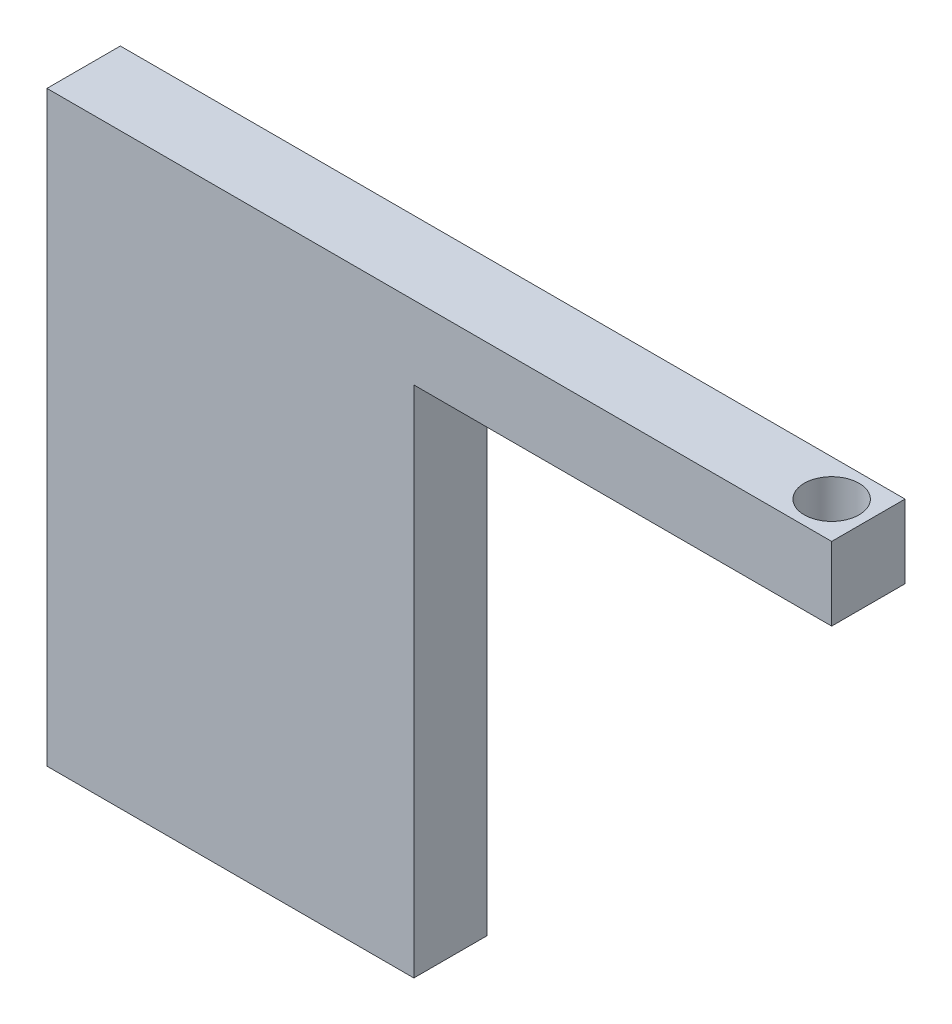
ISO-10303-21;
HEADER;
FILE_DESCRIPTION(('STEP AP214'),'2;1');
FILE_NAME('part.step','',(''),(''),'','','');
FILE_SCHEMA(('AUTOMOTIVE_DESIGN { 1 0 10303 214 1 1 1 1 }'));
ENDSEC;
DATA;
#1=APPLICATION_CONTEXT('core data for automotive mechanical design processes');
#2=APPLICATION_PROTOCOL_DEFINITION('international standard','automotive_design',2000,#1);
#3=PRODUCT_CONTEXT('',#1,'mechanical');
#4=PRODUCT('Part','Part','',(#3));
#5=PRODUCT_RELATED_PRODUCT_CATEGORY('part','',(#4));
#6=PRODUCT_DEFINITION_FORMATION('','',#4);
#7=PRODUCT_DEFINITION_CONTEXT('part definition',#1,'design');
#8=PRODUCT_DEFINITION('design','',#6,#7);
#9=PRODUCT_DEFINITION_SHAPE('','',#8);
#10=(LENGTH_UNIT() NAMED_UNIT(*) SI_UNIT(.MILLI.,.METRE.));
#11=(NAMED_UNIT(*) PLANE_ANGLE_UNIT() SI_UNIT($,.RADIAN.));
#12=(NAMED_UNIT(*) SI_UNIT($,.STERADIAN.) SOLID_ANGLE_UNIT());
#13=UNCERTAINTY_MEASURE_WITH_UNIT(LENGTH_MEASURE(1.E-05),#10,'distance_accuracy_value','');
#14=(GEOMETRIC_REPRESENTATION_CONTEXT(3) GLOBAL_UNCERTAINTY_ASSIGNED_CONTEXT((#13)) GLOBAL_UNIT_ASSIGNED_CONTEXT((#10,
#11,#12)) REPRESENTATION_CONTEXT('',''));
#15=CARTESIAN_POINT('',(0.,0.,0.));
#16=DIRECTION('',(0.,0.,1.));
#17=DIRECTION('',(1.,0.,0.));
#18=AXIS2_PLACEMENT_3D('',#15,#16,#17);
#19=CARTESIAN_POINT('',(-106.611570247934,197.933884297521,10.));
#20=DIRECTION('',(0.,-1.,0.));
#21=DIRECTION('',(0.,0.,-1.));
#22=AXIS2_PLACEMENT_3D('',#19,#20,#21);
#23=PLANE('',#22);
#24=CARTESIAN_POINT('',(-4.66942148793389,197.933884297521,5.));
#25=DIRECTION('',(0.,-1.,0.));
#26=DIRECTION('',(0.,0.,-1.));
#27=AXIS2_PLACEMENT_3D('',#24,#25,#26);
#28=CIRCLE('',#27,3.73526488773257);
#29=CARTESIAN_POINT('',(-4.66942148793389,197.933884297521,1.26473511226743));
#30=VERTEX_POINT('',#29);
#31=EDGE_CURVE('E122',#30,#30,#28,.T.);
#32=ORIENTED_EDGE('',*,*,#31,.T.);
#33=EDGE_LOOP('',(#32));
#34=FACE_BOUND('',#33,.T.);
#35=DIRECTION('',(-1.,0.,0.));
#36=VECTOR('',#35,1.);
#37=CARTESIAN_POINT('',(-106.611570247934,197.933884297521,0.));
#38=LINE('',#37,#36);
#39=CARTESIAN_POINT('',(0.33057851206611,197.933884297521,0.));
#40=VERTEX_POINT('',#39);
#41=CARTESIAN_POINT('',(-106.611570247934,197.933884297521,0.));
#42=VERTEX_POINT('',#41);
#43=EDGE_CURVE('E118',#40,#42,#38,.T.);
#44=ORIENTED_EDGE('',*,*,#43,.T.);
#45=DIRECTION('',(0.,0.,-1.));
#46=VECTOR('',#45,1.);
#47=CARTESIAN_POINT('',(-106.611570247934,197.933884297521,10.));
#48=LINE('',#47,#46);
#49=CARTESIAN_POINT('',(-106.611570247934,197.933884297521,10.));
#50=VERTEX_POINT('',#49);
#51=EDGE_CURVE('E11',#50,#42,#48,.T.);
#52=ORIENTED_EDGE('',*,*,#51,.F.);
#53=DIRECTION('',(-1.,0.,0.));
#54=VECTOR('',#53,1.);
#55=CARTESIAN_POINT('',(-106.611570247934,197.933884297521,10.));
#56=LINE('',#55,#54);
#57=CARTESIAN_POINT('',(0.33057851206611,197.933884297521,10.));
#58=VERTEX_POINT('',#57);
#59=EDGE_CURVE('E129',#58,#50,#56,.T.);
#60=ORIENTED_EDGE('',*,*,#59,.F.);
#61=DIRECTION('',(0.,0.,-1.));
#62=VECTOR('',#61,1.);
#63=CARTESIAN_POINT('',(0.33057851206611,197.933884297521,10.));
#64=LINE('',#63,#62);
#65=EDGE_CURVE('E114',#58,#40,#64,.T.);
#66=ORIENTED_EDGE('',*,*,#65,.T.);
#67=EDGE_LOOP('',(#44,#52,#60,#66));
#68=FACE_BOUND('',#67,.T.);
#69=ADVANCED_FACE('F33',(#34,#68),#23,.F.);
#70=CARTESIAN_POINT('',(-106.611570247934,117.933884297521,10.));
#71=DIRECTION('',(1.,0.,0.));
#72=DIRECTION('',(0.,0.,-1.));
#73=AXIS2_PLACEMENT_3D('',#70,#71,#72);
#74=PLANE('',#73);
#75=DIRECTION('',(0.,-1.,0.));
#76=VECTOR('',#75,1.);
#77=CARTESIAN_POINT('',(-106.611570247934,117.933884297521,0.));
#78=LINE('',#77,#76);
#79=CARTESIAN_POINT('',(-106.611570247934,117.933884297521,0.));
#80=VERTEX_POINT('',#79);
#81=EDGE_CURVE('E121',#42,#80,#78,.T.);
#82=ORIENTED_EDGE('',*,*,#81,.T.);
#83=DIRECTION('',(0.,0.,-1.));
#84=VECTOR('',#83,1.);
#85=CARTESIAN_POINT('',(-106.611570247934,117.933884297521,10.));
#86=LINE('',#85,#84);
#87=CARTESIAN_POINT('',(-106.611570247934,117.933884297521,10.));
#88=VERTEX_POINT('',#87);
#89=EDGE_CURVE('E42',#88,#80,#86,.T.);
#90=ORIENTED_EDGE('',*,*,#89,.F.);
#91=DIRECTION('',(0.,-1.,0.));
#92=VECTOR('',#91,1.);
#93=CARTESIAN_POINT('',(-106.611570247934,117.933884297521,10.));
#94=LINE('',#93,#92);
#95=EDGE_CURVE('E87',#50,#88,#94,.T.);
#96=ORIENTED_EDGE('',*,*,#95,.F.);
#97=ORIENTED_EDGE('',*,*,#51,.T.);
#98=EDGE_LOOP('',(#82,#90,#96,#97));
#99=FACE_BOUND('',#98,.T.);
#100=ADVANCED_FACE('F155',(#99),#74,.F.);
#101=CARTESIAN_POINT('',(-56.6115702479339,117.933884297521,10.));
#102=DIRECTION('',(0.,1.,0.));
#103=DIRECTION('',(-1.,0.,0.));
#104=AXIS2_PLACEMENT_3D('',#101,#102,#103);
#105=PLANE('',#104);
#106=DIRECTION('',(1.,0.,0.));
#107=VECTOR('',#106,1.);
#108=CARTESIAN_POINT('',(-56.6115702479339,117.933884297521,0.));
#109=LINE('',#108,#107);
#110=CARTESIAN_POINT('',(-56.6115702479339,117.933884297521,0.));
#111=VERTEX_POINT('',#110);
#112=EDGE_CURVE('E124',#80,#111,#109,.T.);
#113=ORIENTED_EDGE('',*,*,#112,.T.);
#114=DIRECTION('',(0.,0.,-1.));
#115=VECTOR('',#114,1.);
#116=CARTESIAN_POINT('',(-56.6115702479339,117.933884297521,10.));
#117=LINE('',#116,#115);
#118=CARTESIAN_POINT('',(-56.6115702479339,117.933884297521,10.));
#119=VERTEX_POINT('',#118);
#120=EDGE_CURVE('E109',#119,#111,#117,.T.);
#121=ORIENTED_EDGE('',*,*,#120,.F.);
#122=DIRECTION('',(1.,0.,0.));
#123=VECTOR('',#122,1.);
#124=CARTESIAN_POINT('',(-56.6115702479339,117.933884297521,10.));
#125=LINE('',#124,#123);
#126=EDGE_CURVE('E100',#88,#119,#125,.T.);
#127=ORIENTED_EDGE('',*,*,#126,.F.);
#128=ORIENTED_EDGE('',*,*,#89,.T.);
#129=EDGE_LOOP('',(#113,#121,#127,#128));
#130=FACE_BOUND('',#129,.T.);
#131=ADVANCED_FACE('F136',(#130),#105,.F.);
#132=CARTESIAN_POINT('',(-56.6115702479339,187.933884297521,10.));
#133=DIRECTION('',(-1.,0.,0.));
#134=DIRECTION('',(0.,0.,1.));
#135=AXIS2_PLACEMENT_3D('',#132,#133,#134);
#136=PLANE('',#135);
#137=DIRECTION('',(0.,1.,0.));
#138=VECTOR('',#137,1.);
#139=CARTESIAN_POINT('',(-56.6115702479339,187.933884297521,0.));
#140=LINE('',#139,#138);
#141=CARTESIAN_POINT('',(-56.6115702479339,187.933884297521,0.));
#142=VERTEX_POINT('',#141);
#143=EDGE_CURVE('E108',#111,#142,#140,.T.);
#144=ORIENTED_EDGE('',*,*,#143,.T.);
#145=DIRECTION('',(0.,0.,-1.));
#146=VECTOR('',#145,1.);
#147=CARTESIAN_POINT('',(-56.6115702479339,187.933884297521,10.));
#148=LINE('',#147,#146);
#149=CARTESIAN_POINT('',(-56.6115702479339,187.933884297521,10.));
#150=VERTEX_POINT('',#149);
#151=EDGE_CURVE('E105',#150,#142,#148,.T.);
#152=ORIENTED_EDGE('',*,*,#151,.F.);
#153=DIRECTION('',(0.,1.,0.));
#154=VECTOR('',#153,1.);
#155=CARTESIAN_POINT('',(-56.6115702479339,187.933884297521,10.));
#156=LINE('',#155,#154);
#157=EDGE_CURVE('E94',#119,#150,#156,.T.);
#158=ORIENTED_EDGE('',*,*,#157,.F.);
#159=ORIENTED_EDGE('',*,*,#120,.T.);
#160=EDGE_LOOP('',(#144,#152,#158,#159));
#161=FACE_BOUND('',#160,.T.);
#162=ADVANCED_FACE('F106',(#161),#136,.F.);
#163=CARTESIAN_POINT('',(0.330578512066138,187.933884297521,10.));
#164=DIRECTION('',(0.,1.,0.));
#165=DIRECTION('',(-1.,0.,0.));
#166=AXIS2_PLACEMENT_3D('',#163,#164,#165);
#167=PLANE('',#166);
#168=CARTESIAN_POINT('',(-4.66942148793389,187.933884297521,5.));
#169=DIRECTION('',(0.,1.,0.));
#170=DIRECTION('',(-1.,0.,0.));
#171=AXIS2_PLACEMENT_3D('',#168,#169,#170);
#172=CIRCLE('',#171,3.73526488773257);
#173=CARTESIAN_POINT('',(-8.40468637566646,187.933884297521,5.));
#174=VERTEX_POINT('',#173);
#175=EDGE_CURVE('E36',#174,#174,#172,.T.);
#176=ORIENTED_EDGE('',*,*,#175,.T.);
#177=EDGE_LOOP('',(#176));
#178=FACE_BOUND('',#177,.T.);
#179=DIRECTION('',(1.,0.,0.));
#180=VECTOR('',#179,1.);
#181=CARTESIAN_POINT('',(0.330578512066138,187.933884297521,0.));
#182=LINE('',#181,#180);
#183=CARTESIAN_POINT('',(0.330578512066138,187.933884297521,0.));
#184=VERTEX_POINT('',#183);
#185=EDGE_CURVE('E73',#142,#184,#182,.T.);
#186=ORIENTED_EDGE('',*,*,#185,.T.);
#187=DIRECTION('',(0.,0.,-1.));
#188=VECTOR('',#187,1.);
#189=CARTESIAN_POINT('',(0.330578512066138,187.933884297521,10.));
#190=LINE('',#189,#188);
#191=CARTESIAN_POINT('',(0.330578512066138,187.933884297521,10.));
#192=VERTEX_POINT('',#191);
#193=EDGE_CURVE('E110',#192,#184,#190,.T.);
#194=ORIENTED_EDGE('',*,*,#193,.F.);
#195=DIRECTION('',(1.,0.,0.));
#196=VECTOR('',#195,1.);
#197=CARTESIAN_POINT('',(0.330578512066138,187.933884297521,10.));
#198=LINE('',#197,#196);
#199=EDGE_CURVE('E98',#150,#192,#198,.T.);
#200=ORIENTED_EDGE('',*,*,#199,.F.);
#201=ORIENTED_EDGE('',*,*,#151,.T.);
#202=EDGE_LOOP('',(#186,#194,#200,#201));
#203=FACE_BOUND('',#202,.T.);
#204=ADVANCED_FACE('F112',(#178,#203),#167,.F.);
#205=CARTESIAN_POINT('',(0.33057851206611,197.933884297521,10.));
#206=DIRECTION('',(-1.,0.,0.));
#207=DIRECTION('',(0.,-1.,0.));
#208=AXIS2_PLACEMENT_3D('',#205,#206,#207);
#209=PLANE('',#208);
#210=DIRECTION('',(0.,1.,0.));
#211=VECTOR('',#210,1.);
#212=CARTESIAN_POINT('',(0.33057851206611,197.933884297521,0.));
#213=LINE('',#212,#211);
#214=EDGE_CURVE('E79',#184,#40,#213,.T.);
#215=ORIENTED_EDGE('',*,*,#214,.T.);
#216=ORIENTED_EDGE('',*,*,#65,.F.);
#217=DIRECTION('',(0.,1.,0.));
#218=VECTOR('',#217,1.);
#219=CARTESIAN_POINT('',(0.33057851206611,197.933884297521,10.));
#220=LINE('',#219,#218);
#221=EDGE_CURVE('E50',#192,#58,#220,.T.);
#222=ORIENTED_EDGE('',*,*,#221,.F.);
#223=ORIENTED_EDGE('',*,*,#193,.T.);
#224=EDGE_LOOP('',(#215,#216,#222,#223));
#225=FACE_BOUND('',#224,.T.);
#226=ADVANCED_FACE('F143',(#225),#209,.F.);
#227=CARTESIAN_POINT('',(0.,0.,10.));
#228=DIRECTION('',(0.,0.,-1.));
#229=DIRECTION('',(-1.,0.,0.));
#230=AXIS2_PLACEMENT_3D('',#227,#228,#229);
#231=PLANE('',#230);
#232=ORIENTED_EDGE('',*,*,#59,.T.);
#233=ORIENTED_EDGE('',*,*,#95,.T.);
#234=ORIENTED_EDGE('',*,*,#126,.T.);
#235=ORIENTED_EDGE('',*,*,#157,.T.);
#236=ORIENTED_EDGE('',*,*,#199,.T.);
#237=ORIENTED_EDGE('',*,*,#221,.T.);
#238=EDGE_LOOP('',(#232,#233,#234,#235,#236,#237));
#239=FACE_BOUND('',#238,.T.);
#240=ADVANCED_FACE('F96',(#239),#231,.F.);
#241=CARTESIAN_POINT('',(0.,0.,0.));
#242=DIRECTION('',(0.,0.,-1.));
#243=DIRECTION('',(-1.,0.,0.));
#244=AXIS2_PLACEMENT_3D('',#241,#242,#243);
#245=PLANE('',#244);
#246=ORIENTED_EDGE('',*,*,#43,.F.);
#247=ORIENTED_EDGE('',*,*,#214,.F.);
#248=ORIENTED_EDGE('',*,*,#185,.F.);
#249=ORIENTED_EDGE('',*,*,#143,.F.);
#250=ORIENTED_EDGE('',*,*,#112,.F.);
#251=ORIENTED_EDGE('',*,*,#81,.F.);
#252=EDGE_LOOP('',(#246,#247,#248,#249,#250,#251));
#253=FACE_BOUND('',#252,.T.);
#254=ADVANCED_FACE('F139',(#253),#245,.T.);
#255=CARTESIAN_POINT('',(-4.66942148793389,117.933884297521,5.));
#256=DIRECTION('',(0.,1.,0.));
#257=DIRECTION('',(0.,0.,1.));
#258=AXIS2_PLACEMENT_3D('',#255,#256,#257);
#259=CYLINDRICAL_SURFACE('',#258,3.73526488773257);
#260=ORIENTED_EDGE('',*,*,#175,.F.);
#261=EDGE_LOOP('',(#260));
#262=FACE_BOUND('',#261,.T.);
#263=ORIENTED_EDGE('',*,*,#31,.F.);
#264=EDGE_LOOP('',(#263));
#265=FACE_BOUND('',#264,.T.);
#266=ADVANCED_FACE('F169',(#262,#265),#259,.F.);
#267=CLOSED_SHELL('',(#69,#100,#131,#162,#204,#226,#240,#254,#266));
#268=MANIFOLD_SOLID_BREP('B2',#267);
#269=ADVANCED_BREP_SHAPE_REPRESENTATION('',(#18,#268),#14);
#270=SHAPE_DEFINITION_REPRESENTATION(#9,#269);
ENDSEC;
END-ISO-10303-21;
